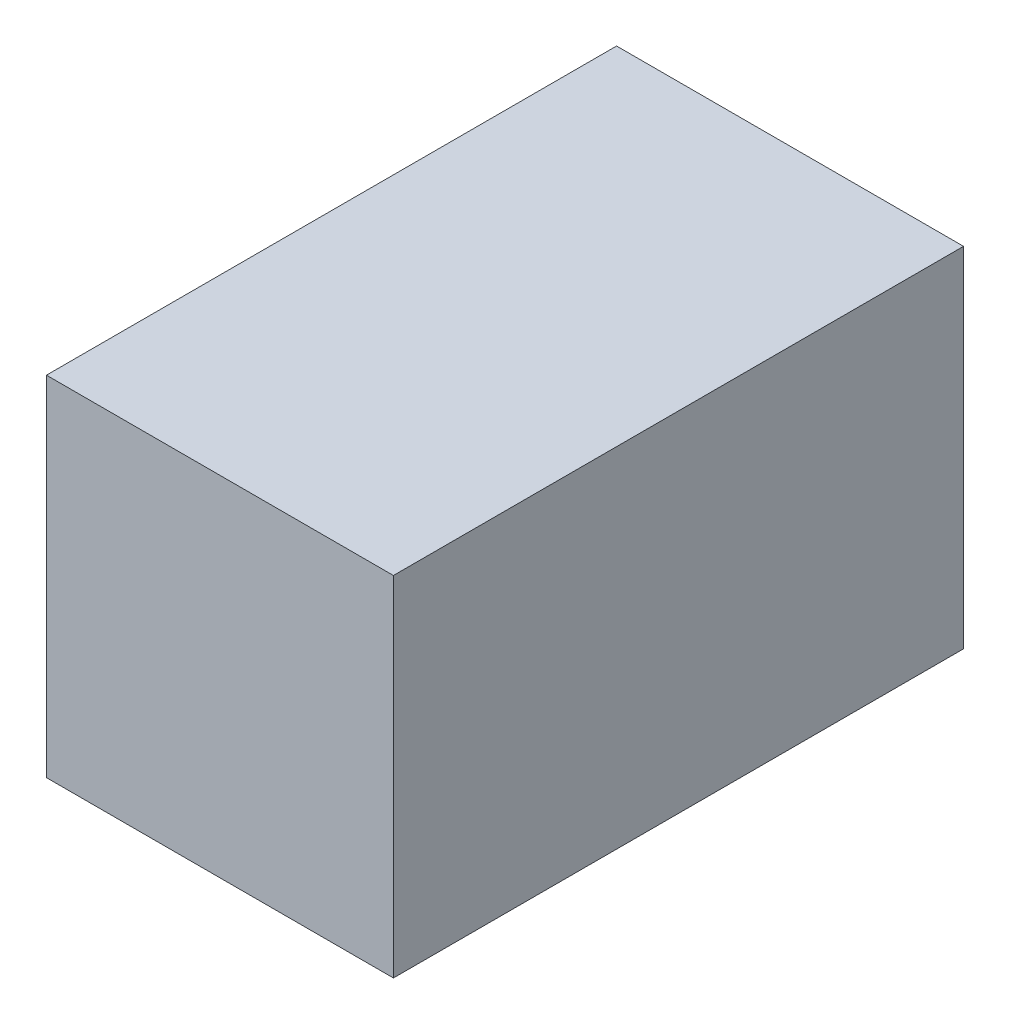
ISO-10303-21;
HEADER;
FILE_DESCRIPTION(('STEP AP214'),'2;1');
FILE_NAME('part.step','',(''),(''),'','','');
FILE_SCHEMA(('AUTOMOTIVE_DESIGN { 1 0 10303 214 1 1 1 1 }'));
ENDSEC;
DATA;
#1=APPLICATION_CONTEXT('core data for automotive mechanical design processes');
#2=APPLICATION_PROTOCOL_DEFINITION('international standard','automotive_design',2000,#1);
#3=PRODUCT_CONTEXT('',#1,'mechanical');
#4=PRODUCT('Part','Part','',(#3));
#5=PRODUCT_RELATED_PRODUCT_CATEGORY('part','',(#4));
#6=PRODUCT_DEFINITION_FORMATION('','',#4);
#7=PRODUCT_DEFINITION_CONTEXT('part definition',#1,'design');
#8=PRODUCT_DEFINITION('design','',#6,#7);
#9=PRODUCT_DEFINITION_SHAPE('','',#8);
#10=(LENGTH_UNIT() NAMED_UNIT(*) SI_UNIT(.MILLI.,.METRE.));
#11=(NAMED_UNIT(*) PLANE_ANGLE_UNIT() SI_UNIT($,.RADIAN.));
#12=(NAMED_UNIT(*) SI_UNIT($,.STERADIAN.) SOLID_ANGLE_UNIT());
#13=UNCERTAINTY_MEASURE_WITH_UNIT(LENGTH_MEASURE(1.E-05),#10,'distance_accuracy_value','');
#14=(GEOMETRIC_REPRESENTATION_CONTEXT(3) GLOBAL_UNCERTAINTY_ASSIGNED_CONTEXT((#13)) GLOBAL_UNIT_ASSIGNED_CONTEXT((#10,
#11,#12)) REPRESENTATION_CONTEXT('',''));
#15=CARTESIAN_POINT('',(0.,0.,0.));
#16=DIRECTION('',(0.,0.,1.));
#17=DIRECTION('',(1.,0.,0.));
#18=AXIS2_PLACEMENT_3D('',#15,#16,#17);
#19=CARTESIAN_POINT('',(106.5,-107.,350.));
#20=DIRECTION('',(-1.,0.,0.));
#21=DIRECTION('',(0.,0.,1.));
#22=AXIS2_PLACEMENT_3D('',#19,#20,#21);
#23=PLANE('',#22);
#24=DIRECTION('',(0.,1.,0.));
#25=VECTOR('',#24,1.);
#26=CARTESIAN_POINT('',(106.5,-107.,0.));
#27=LINE('',#26,#25);
#28=CARTESIAN_POINT('',(106.5,-107.,0.));
#29=VERTEX_POINT('',#28);
#30=CARTESIAN_POINT('',(106.5,107.,0.));
#31=VERTEX_POINT('',#30);
#32=EDGE_CURVE('E97',#29,#31,#27,.T.);
#33=ORIENTED_EDGE('',*,*,#32,.T.);
#34=DIRECTION('',(0.,0.,-1.));
#35=VECTOR('',#34,1.);
#36=CARTESIAN_POINT('',(106.5,107.,350.));
#37=LINE('',#36,#35);
#38=CARTESIAN_POINT('',(106.5,107.,350.));
#39=VERTEX_POINT('',#38);
#40=EDGE_CURVE('E11',#39,#31,#37,.T.);
#41=ORIENTED_EDGE('',*,*,#40,.F.);
#42=DIRECTION('',(0.,1.,0.));
#43=VECTOR('',#42,1.);
#44=CARTESIAN_POINT('',(106.5,-107.,350.));
#45=LINE('',#44,#43);
#46=CARTESIAN_POINT('',(106.5,-107.,350.));
#47=VERTEX_POINT('',#46);
#48=EDGE_CURVE('E85',#47,#39,#45,.T.);
#49=ORIENTED_EDGE('',*,*,#48,.F.);
#50=DIRECTION('',(0.,0.,-1.));
#51=VECTOR('',#50,1.);
#52=CARTESIAN_POINT('',(106.5,-107.,350.));
#53=LINE('',#52,#51);
#54=EDGE_CURVE('E93',#47,#29,#53,.T.);
#55=ORIENTED_EDGE('',*,*,#54,.T.);
#56=EDGE_LOOP('',(#33,#41,#49,#55));
#57=FACE_BOUND('',#56,.T.);
#58=ADVANCED_FACE('F34',(#57),#23,.F.);
#59=CARTESIAN_POINT('',(-106.5,107.,350.));
#60=DIRECTION('',(0.,-1.,0.));
#61=DIRECTION('',(0.,0.,-1.));
#62=AXIS2_PLACEMENT_3D('',#59,#60,#61);
#63=PLANE('',#62);
#64=DIRECTION('',(-1.,0.,0.));
#65=VECTOR('',#64,1.);
#66=CARTESIAN_POINT('',(-106.5,107.,0.));
#67=LINE('',#66,#65);
#68=CARTESIAN_POINT('',(-106.5,107.,0.));
#69=VERTEX_POINT('',#68);
#70=EDGE_CURVE('E89',#31,#69,#67,.T.);
#71=ORIENTED_EDGE('',*,*,#70,.T.);
#72=DIRECTION('',(0.,0.,-1.));
#73=VECTOR('',#72,1.);
#74=CARTESIAN_POINT('',(-106.5,107.,350.));
#75=LINE('',#74,#73);
#76=CARTESIAN_POINT('',(-106.5,107.,350.));
#77=VERTEX_POINT('',#76);
#78=EDGE_CURVE('E42',#77,#69,#75,.T.);
#79=ORIENTED_EDGE('',*,*,#78,.F.);
#80=DIRECTION('',(-1.,0.,0.));
#81=VECTOR('',#80,1.);
#82=CARTESIAN_POINT('',(-106.5,107.,350.));
#83=LINE('',#82,#81);
#84=EDGE_CURVE('E80',#39,#77,#83,.T.);
#85=ORIENTED_EDGE('',*,*,#84,.F.);
#86=ORIENTED_EDGE('',*,*,#40,.T.);
#87=EDGE_LOOP('',(#71,#79,#85,#86));
#88=FACE_BOUND('',#87,.T.);
#89=ADVANCED_FACE('F88',(#88),#63,.F.);
#90=CARTESIAN_POINT('',(-106.5,-107.,350.));
#91=DIRECTION('',(1.,0.,0.));
#92=DIRECTION('',(0.,0.,-1.));
#93=AXIS2_PLACEMENT_3D('',#90,#91,#92);
#94=PLANE('',#93);
#95=DIRECTION('',(0.,-1.,0.));
#96=VECTOR('',#95,1.);
#97=CARTESIAN_POINT('',(-106.5,-107.,0.));
#98=LINE('',#97,#96);
#99=CARTESIAN_POINT('',(-106.5,-107.,0.));
#100=VERTEX_POINT('',#99);
#101=EDGE_CURVE('E67',#69,#100,#98,.T.);
#102=ORIENTED_EDGE('',*,*,#101,.T.);
#103=DIRECTION('',(0.,0.,-1.));
#104=VECTOR('',#103,1.);
#105=CARTESIAN_POINT('',(-106.5,-107.,350.));
#106=LINE('',#105,#104);
#107=CARTESIAN_POINT('',(-106.5,-107.,350.));
#108=VERTEX_POINT('',#107);
#109=EDGE_CURVE('E90',#108,#100,#106,.T.);
#110=ORIENTED_EDGE('',*,*,#109,.F.);
#111=DIRECTION('',(0.,-1.,0.));
#112=VECTOR('',#111,1.);
#113=CARTESIAN_POINT('',(-106.5,-107.,350.));
#114=LINE('',#113,#112);
#115=EDGE_CURVE('E83',#77,#108,#114,.T.);
#116=ORIENTED_EDGE('',*,*,#115,.F.);
#117=ORIENTED_EDGE('',*,*,#78,.T.);
#118=EDGE_LOOP('',(#102,#110,#116,#117));
#119=FACE_BOUND('',#118,.T.);
#120=ADVANCED_FACE('F91',(#119),#94,.F.);
#121=CARTESIAN_POINT('',(-106.5,-107.,350.));
#122=DIRECTION('',(0.,1.,0.));
#123=DIRECTION('',(0.,0.,1.));
#124=AXIS2_PLACEMENT_3D('',#121,#122,#123);
#125=PLANE('',#124);
#126=DIRECTION('',(1.,0.,0.));
#127=VECTOR('',#126,1.);
#128=CARTESIAN_POINT('',(-106.5,-107.,0.));
#129=LINE('',#128,#127);
#130=EDGE_CURVE('E73',#100,#29,#129,.T.);
#131=ORIENTED_EDGE('',*,*,#130,.T.);
#132=ORIENTED_EDGE('',*,*,#54,.F.);
#133=DIRECTION('',(1.,0.,0.));
#134=VECTOR('',#133,1.);
#135=CARTESIAN_POINT('',(-106.5,-107.,350.));
#136=LINE('',#135,#134);
#137=EDGE_CURVE('E50',#108,#47,#136,.T.);
#138=ORIENTED_EDGE('',*,*,#137,.F.);
#139=ORIENTED_EDGE('',*,*,#109,.T.);
#140=EDGE_LOOP('',(#131,#132,#138,#139));
#141=FACE_BOUND('',#140,.T.);
#142=ADVANCED_FACE('F104',(#141),#125,.F.);
#143=CARTESIAN_POINT('',(0.,0.,350.));
#144=DIRECTION('',(0.,0.,-1.));
#145=DIRECTION('',(-1.,0.,0.));
#146=AXIS2_PLACEMENT_3D('',#143,#144,#145);
#147=PLANE('',#146);
#148=ORIENTED_EDGE('',*,*,#48,.T.);
#149=ORIENTED_EDGE('',*,*,#84,.T.);
#150=ORIENTED_EDGE('',*,*,#115,.T.);
#151=ORIENTED_EDGE('',*,*,#137,.T.);
#152=EDGE_LOOP('',(#148,#149,#150,#151));
#153=FACE_BOUND('',#152,.T.);
#154=ADVANCED_FACE('F81',(#153),#147,.F.);
#155=CARTESIAN_POINT('',(0.,0.,0.));
#156=DIRECTION('',(0.,0.,-1.));
#157=DIRECTION('',(-1.,0.,0.));
#158=AXIS2_PLACEMENT_3D('',#155,#156,#157);
#159=PLANE('',#158);
#160=ORIENTED_EDGE('',*,*,#32,.F.);
#161=ORIENTED_EDGE('',*,*,#130,.F.);
#162=ORIENTED_EDGE('',*,*,#101,.F.);
#163=ORIENTED_EDGE('',*,*,#70,.F.);
#164=EDGE_LOOP('',(#160,#161,#162,#163));
#165=FACE_BOUND('',#164,.T.);
#166=ADVANCED_FACE('F107',(#165),#159,.T.);
#167=CLOSED_SHELL('',(#58,#89,#120,#142,#154,#166));
#168=MANIFOLD_SOLID_BREP('B2',#167);
#169=ADVANCED_BREP_SHAPE_REPRESENTATION('',(#18,#168),#14);
#170=SHAPE_DEFINITION_REPRESENTATION(#9,#169);
ENDSEC;
END-ISO-10303-21;
